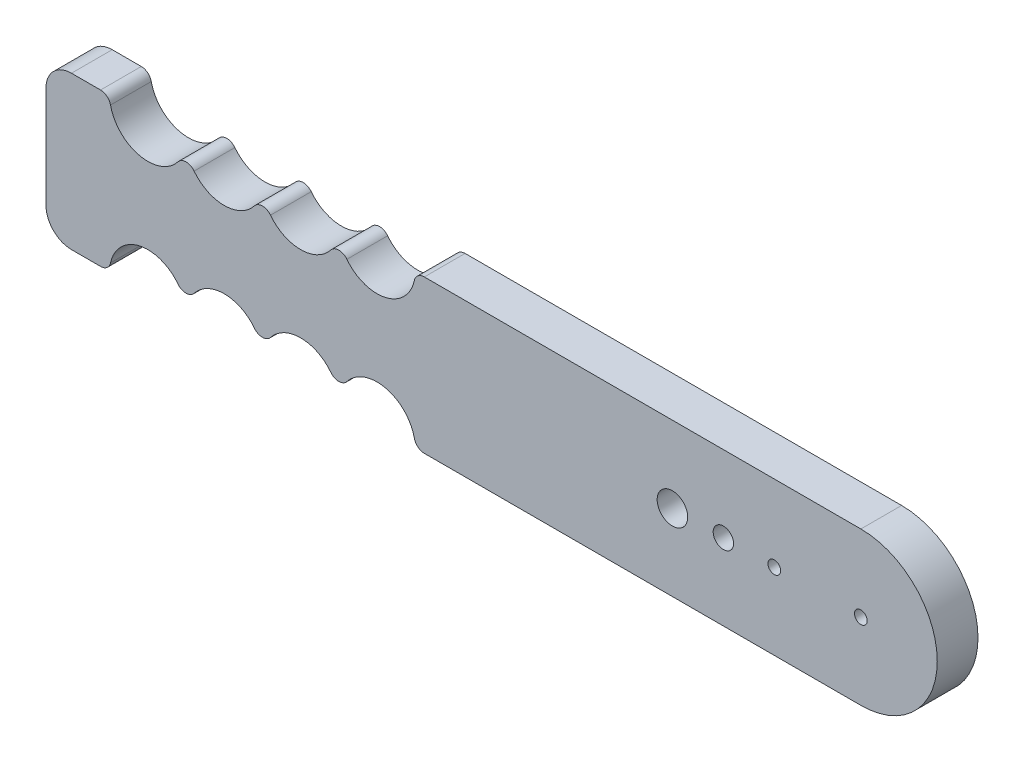
ISO-10303-21;
HEADER;
FILE_DESCRIPTION(('STEP AP214'),'2;1');
FILE_NAME('part.step','',(''),(''),'','','');
FILE_SCHEMA(('AUTOMOTIVE_DESIGN { 1 0 10303 214 1 1 1 1 }'));
ENDSEC;
DATA;
#1=APPLICATION_CONTEXT('core data for automotive mechanical design processes');
#2=APPLICATION_PROTOCOL_DEFINITION('international standard','automotive_design',2000,#1);
#3=PRODUCT_CONTEXT('',#1,'mechanical');
#4=PRODUCT('Part','Part','',(#3));
#5=PRODUCT_RELATED_PRODUCT_CATEGORY('part','',(#4));
#6=PRODUCT_DEFINITION_FORMATION('','',#4);
#7=PRODUCT_DEFINITION_CONTEXT('part definition',#1,'design');
#8=PRODUCT_DEFINITION('design','',#6,#7);
#9=PRODUCT_DEFINITION_SHAPE('','',#8);
#10=(LENGTH_UNIT() NAMED_UNIT(*) SI_UNIT(.MILLI.,.METRE.));
#11=(NAMED_UNIT(*) PLANE_ANGLE_UNIT() SI_UNIT($,.RADIAN.));
#12=(NAMED_UNIT(*) SI_UNIT($,.STERADIAN.) SOLID_ANGLE_UNIT());
#13=UNCERTAINTY_MEASURE_WITH_UNIT(LENGTH_MEASURE(1.E-05),#10,'distance_accuracy_value','');
#14=(GEOMETRIC_REPRESENTATION_CONTEXT(3) GLOBAL_UNCERTAINTY_ASSIGNED_CONTEXT((#13)) GLOBAL_UNIT_ASSIGNED_CONTEXT((#10,
#11,#12)) REPRESENTATION_CONTEXT('',''));
#15=CARTESIAN_POINT('',(0.,0.,0.));
#16=DIRECTION('',(0.,0.,1.));
#17=DIRECTION('',(1.,0.,0.));
#18=AXIS2_PLACEMENT_3D('',#15,#16,#17);
#19=CARTESIAN_POINT('',(0.,0.,8.));
#20=DIRECTION('',(0.,0.,1.));
#21=DIRECTION('',(1.,0.,0.));
#22=AXIS2_PLACEMENT_3D('',#19,#20,#21);
#23=PLANE('',#22);
#24=CARTESIAN_POINT('',(-37.,0.,8.));
#25=DIRECTION('',(0.,0.,1.));
#26=DIRECTION('',(1.,0.,0.));
#27=AXIS2_PLACEMENT_3D('',#24,#25,#26);
#28=CIRCLE('',#27,3.);
#29=CARTESIAN_POINT('',(-34.,0.,8.));
#30=VERTEX_POINT('',#29);
#31=EDGE_CURVE('E786',#30,#30,#28,.T.);
#32=ORIENTED_EDGE('',*,*,#31,.F.);
#33=EDGE_LOOP('',(#32));
#34=FACE_BOUND('',#33,.T.);
#35=CARTESIAN_POINT('',(0.,0.,8.));
#36=DIRECTION('',(0.,0.,1.));
#37=DIRECTION('',(1.,0.,0.));
#38=AXIS2_PLACEMENT_3D('',#35,#36,#37);
#39=CIRCLE('',#38,1.25);
#40=CARTESIAN_POINT('',(1.25,0.,8.));
#41=VERTEX_POINT('',#40);
#42=EDGE_CURVE('E383',#41,#41,#39,.T.);
#43=ORIENTED_EDGE('',*,*,#42,.F.);
#44=EDGE_LOOP('',(#43));
#45=FACE_BOUND('',#44,.T.);
#46=CARTESIAN_POINT('',(-95.,-15.,8.));
#47=DIRECTION('',(0.,0.,-1.));
#48=DIRECTION('',(-1.,0.,0.));
#49=AXIS2_PLACEMENT_3D('',#46,#47,#48);
#50=CIRCLE('',#49,7.50000000000001);
#51=CARTESIAN_POINT('',(-100.921052631579,-10.3966169251221,8.));
#52=VERTEX_POINT('',#51);
#53=CARTESIAN_POINT('',(-87.6680885706552,-13.421052631579,8.));
#54=VERTEX_POINT('',#53);
#55=EDGE_CURVE('E434',#52,#54,#50,.T.);
#56=ORIENTED_EDGE('',*,*,#55,.T.);
#57=CARTESIAN_POINT('',(-85.7129121894966,-13.,8.));
#58=DIRECTION('',(0.,0.,1.));
#59=DIRECTION('',(1.,0.,0.));
#60=AXIS2_PLACEMENT_3D('',#57,#58,#59);
#61=CIRCLE('',#60,2.);
#62=CARTESIAN_POINT('',(-85.7129121894966,-15.,8.));
#63=VERTEX_POINT('',#62);
#64=EDGE_CURVE('E304',#54,#63,#61,.T.);
#65=ORIENTED_EDGE('',*,*,#64,.T.);
#66=DIRECTION('',(1.,0.,0.));
#67=VECTOR('',#66,1.);
#68=CARTESIAN_POINT('',(0.,-15.,8.));
#69=LINE('',#68,#67);
#70=CARTESIAN_POINT('',(0.,-15.,8.));
#71=VERTEX_POINT('',#70);
#72=EDGE_CURVE('E225',#63,#71,#69,.T.);
#73=ORIENTED_EDGE('',*,*,#72,.T.);
#74=CARTESIAN_POINT('',(0.,0.,8.));
#75=DIRECTION('',(0.,0.,1.));
#76=DIRECTION('',(1.,0.,0.));
#77=AXIS2_PLACEMENT_3D('',#74,#75,#76);
#78=CIRCLE('',#77,15.);
#79=CARTESIAN_POINT('',(0.,15.,8.));
#80=VERTEX_POINT('',#79);
#81=EDGE_CURVE('E219',#71,#80,#78,.T.);
#82=ORIENTED_EDGE('',*,*,#81,.T.);
#83=DIRECTION('',(-1.,0.,0.));
#84=VECTOR('',#83,1.);
#85=CARTESIAN_POINT('',(0.,15.,8.));
#86=LINE('',#85,#84);
#87=CARTESIAN_POINT('',(-85.7129121894966,15.,8.));
#88=VERTEX_POINT('',#87);
#89=EDGE_CURVE('E208',#80,#88,#86,.T.);
#90=ORIENTED_EDGE('',*,*,#89,.T.);
#91=CARTESIAN_POINT('',(-85.7129121894966,13.,8.));
#92=DIRECTION('',(0.,0.,1.));
#93=DIRECTION('',(1.,0.,0.));
#94=AXIS2_PLACEMENT_3D('',#91,#92,#93);
#95=CIRCLE('',#94,2.);
#96=CARTESIAN_POINT('',(-87.6680885706552,13.4210526315789,8.));
#97=VERTEX_POINT('',#96);
#98=EDGE_CURVE('E294',#88,#97,#95,.T.);
#99=ORIENTED_EDGE('',*,*,#98,.T.);
#100=CARTESIAN_POINT('',(-95.,15.,8.));
#101=DIRECTION('',(0.,0.,-1.));
#102=DIRECTION('',(1.,0.,0.));
#103=AXIS2_PLACEMENT_3D('',#100,#101,#102);
#104=CIRCLE('',#103,7.50000000000001);
#105=CARTESIAN_POINT('',(-100.921052631579,10.3966169251221,8.));
#106=VERTEX_POINT('',#105);
#107=EDGE_CURVE('E218',#97,#106,#104,.T.);
#108=ORIENTED_EDGE('',*,*,#107,.T.);
#109=CARTESIAN_POINT('',(-102.5,9.16904810515469,8.));
#110=DIRECTION('',(0.,0.,1.));
#111=DIRECTION('',(1.,0.,0.));
#112=AXIS2_PLACEMENT_3D('',#109,#110,#111);
#113=CIRCLE('',#112,2.);
#114=CARTESIAN_POINT('',(-104.078947368421,10.3966169251221,8.));
#115=VERTEX_POINT('',#114);
#116=EDGE_CURVE('E292',#106,#115,#113,.T.);
#117=ORIENTED_EDGE('',*,*,#116,.T.);
#118=CARTESIAN_POINT('',(-110.,15.,8.));
#119=DIRECTION('',(0.,0.,-1.));
#120=DIRECTION('',(1.,0.,0.));
#121=AXIS2_PLACEMENT_3D('',#118,#119,#120);
#122=CIRCLE('',#121,7.49999999999999);
#123=CARTESIAN_POINT('',(-115.921052631579,10.3966169251221,8.));
#124=VERTEX_POINT('',#123);
#125=EDGE_CURVE('E409',#115,#124,#122,.T.);
#126=ORIENTED_EDGE('',*,*,#125,.T.);
#127=CARTESIAN_POINT('',(-117.5,9.16904810515469,8.));
#128=DIRECTION('',(0.,0.,1.));
#129=DIRECTION('',(1.,0.,0.));
#130=AXIS2_PLACEMENT_3D('',#127,#128,#129);
#131=CIRCLE('',#130,2.);
#132=CARTESIAN_POINT('',(-119.078947368421,10.3966169251221,8.));
#133=VERTEX_POINT('',#132);
#134=EDGE_CURVE('E290',#124,#133,#131,.T.);
#135=ORIENTED_EDGE('',*,*,#134,.T.);
#136=CARTESIAN_POINT('',(-125.,15.,8.));
#137=DIRECTION('',(0.,0.,-1.));
#138=DIRECTION('',(1.,0.,0.));
#139=AXIS2_PLACEMENT_3D('',#136,#137,#138);
#140=CIRCLE('',#139,7.50000000000001);
#141=CARTESIAN_POINT('',(-130.921052631579,10.3966169251221,8.));
#142=VERTEX_POINT('',#141);
#143=EDGE_CURVE('E408',#133,#142,#140,.T.);
#144=ORIENTED_EDGE('',*,*,#143,.T.);
#145=CARTESIAN_POINT('',(-132.5,9.16904810515468,8.));
#146=DIRECTION('',(0.,0.,1.));
#147=DIRECTION('',(1.,0.,0.));
#148=AXIS2_PLACEMENT_3D('',#145,#146,#147);
#149=CIRCLE('',#148,2.);
#150=CARTESIAN_POINT('',(-134.078947368421,10.3966169251221,8.));
#151=VERTEX_POINT('',#150);
#152=EDGE_CURVE('E288',#142,#151,#149,.T.);
#153=ORIENTED_EDGE('',*,*,#152,.T.);
#154=CARTESIAN_POINT('',(-140.,15.,8.));
#155=DIRECTION('',(0.,0.,-1.));
#156=DIRECTION('',(1.,0.,0.));
#157=AXIS2_PLACEMENT_3D('',#154,#155,#156);
#158=CIRCLE('',#157,7.50000000000001);
#159=CARTESIAN_POINT('',(-147.331911429345,13.4210526315789,8.));
#160=VERTEX_POINT('',#159);
#161=EDGE_CURVE('E344',#151,#160,#158,.T.);
#162=ORIENTED_EDGE('',*,*,#161,.T.);
#163=CARTESIAN_POINT('',(-149.287087810503,13.,8.));
#164=DIRECTION('',(0.,0.,1.));
#165=DIRECTION('',(1.,0.,0.));
#166=AXIS2_PLACEMENT_3D('',#163,#164,#165);
#167=CIRCLE('',#166,2.);
#168=CARTESIAN_POINT('',(-149.287087810503,15.,8.));
#169=VERTEX_POINT('',#168);
#170=EDGE_CURVE('E48',#160,#169,#167,.T.);
#171=ORIENTED_EDGE('',*,*,#170,.T.);
#172=DIRECTION('',(-1.,0.,0.));
#173=VECTOR('',#172,1.);
#174=CARTESIAN_POINT('',(-147.5,15.,8.));
#175=LINE('',#174,#173);
#176=CARTESIAN_POINT('',(-155.,15.,8.));
#177=VERTEX_POINT('',#176);
#178=EDGE_CURVE('E414',#169,#177,#175,.T.);
#179=ORIENTED_EDGE('',*,*,#178,.T.);
#180=CARTESIAN_POINT('',(-155.,9.99999999999998,8.));
#181=DIRECTION('',(0.,0.,1.));
#182=DIRECTION('',(1.,0.,0.));
#183=AXIS2_PLACEMENT_3D('',#180,#181,#182);
#184=CIRCLE('',#183,5.);
#185=CARTESIAN_POINT('',(-160.,9.99999999999998,8.));
#186=VERTEX_POINT('',#185);
#187=EDGE_CURVE('E252',#177,#186,#184,.T.);
#188=ORIENTED_EDGE('',*,*,#187,.T.);
#189=DIRECTION('',(0.,-1.,0.));
#190=VECTOR('',#189,1.);
#191=CARTESIAN_POINT('',(-160.,15.,8.));
#192=LINE('',#191,#190);
#193=CARTESIAN_POINT('',(-160.,-10.,8.));
#194=VERTEX_POINT('',#193);
#195=EDGE_CURVE('E420',#186,#194,#192,.T.);
#196=ORIENTED_EDGE('',*,*,#195,.T.);
#197=CARTESIAN_POINT('',(-155.,-10.,8.));
#198=DIRECTION('',(0.,0.,1.));
#199=DIRECTION('',(1.,0.,0.));
#200=AXIS2_PLACEMENT_3D('',#197,#198,#199);
#201=CIRCLE('',#200,5.);
#202=CARTESIAN_POINT('',(-155.,-15.,8.));
#203=VERTEX_POINT('',#202);
#204=EDGE_CURVE('E254',#194,#203,#201,.T.);
#205=ORIENTED_EDGE('',*,*,#204,.T.);
#206=DIRECTION('',(1.,0.,0.));
#207=VECTOR('',#206,1.);
#208=CARTESIAN_POINT('',(-147.5,-15.,8.));
#209=LINE('',#208,#207);
#210=CARTESIAN_POINT('',(-149.287087810503,-15.,8.));
#211=VERTEX_POINT('',#210);
#212=EDGE_CURVE('E423',#203,#211,#209,.T.);
#213=ORIENTED_EDGE('',*,*,#212,.T.);
#214=CARTESIAN_POINT('',(-149.287087810503,-13.,8.));
#215=DIRECTION('',(0.,0.,1.));
#216=DIRECTION('',(1.,0.,0.));
#217=AXIS2_PLACEMENT_3D('',#214,#215,#216);
#218=CIRCLE('',#217,2.);
#219=CARTESIAN_POINT('',(-147.331911429345,-13.421052631579,8.));
#220=VERTEX_POINT('',#219);
#221=EDGE_CURVE('E296',#211,#220,#218,.T.);
#222=ORIENTED_EDGE('',*,*,#221,.T.);
#223=CARTESIAN_POINT('',(-140.,-15.,8.));
#224=DIRECTION('',(0.,0.,-1.));
#225=DIRECTION('',(-1.,0.,0.));
#226=AXIS2_PLACEMENT_3D('',#223,#224,#225);
#227=CIRCLE('',#226,7.50000000000001);
#228=CARTESIAN_POINT('',(-134.078947368421,-10.3966169251221,8.));
#229=VERTEX_POINT('',#228);
#230=EDGE_CURVE('E426',#220,#229,#227,.T.);
#231=ORIENTED_EDGE('',*,*,#230,.T.);
#232=CARTESIAN_POINT('',(-132.5,-9.1690481051547,8.));
#233=DIRECTION('',(0.,0.,1.));
#234=DIRECTION('',(1.,0.,0.));
#235=AXIS2_PLACEMENT_3D('',#232,#233,#234);
#236=CIRCLE('',#235,2.);
#237=CARTESIAN_POINT('',(-130.921052631579,-10.3966169251221,8.));
#238=VERTEX_POINT('',#237);
#239=EDGE_CURVE('E298',#229,#238,#236,.T.);
#240=ORIENTED_EDGE('',*,*,#239,.T.);
#241=CARTESIAN_POINT('',(-125.,-15.,8.));
#242=DIRECTION('',(0.,0.,-1.));
#243=DIRECTION('',(-1.,0.,0.));
#244=AXIS2_PLACEMENT_3D('',#241,#242,#243);
#245=CIRCLE('',#244,7.50000000000001);
#246=CARTESIAN_POINT('',(-119.078947368421,-10.3966169251221,8.));
#247=VERTEX_POINT('',#246);
#248=EDGE_CURVE('E429',#238,#247,#245,.T.);
#249=ORIENTED_EDGE('',*,*,#248,.T.);
#250=CARTESIAN_POINT('',(-117.5,-9.16904810515471,8.));
#251=DIRECTION('',(0.,0.,1.));
#252=DIRECTION('',(1.,0.,0.));
#253=AXIS2_PLACEMENT_3D('',#250,#251,#252);
#254=CIRCLE('',#253,2.);
#255=CARTESIAN_POINT('',(-115.921052631579,-10.3966169251221,8.));
#256=VERTEX_POINT('',#255);
#257=EDGE_CURVE('E300',#247,#256,#254,.T.);
#258=ORIENTED_EDGE('',*,*,#257,.T.);
#259=CARTESIAN_POINT('',(-110.,-15.,8.));
#260=DIRECTION('',(0.,0.,-1.));
#261=DIRECTION('',(-1.,0.,0.));
#262=AXIS2_PLACEMENT_3D('',#259,#260,#261);
#263=CIRCLE('',#262,7.49999999999999);
#264=CARTESIAN_POINT('',(-104.078947368421,-10.3966169251221,8.));
#265=VERTEX_POINT('',#264);
#266=EDGE_CURVE('E432',#256,#265,#263,.T.);
#267=ORIENTED_EDGE('',*,*,#266,.T.);
#268=CARTESIAN_POINT('',(-102.5,-9.16904810515471,8.));
#269=DIRECTION('',(0.,0.,1.));
#270=DIRECTION('',(1.,0.,0.));
#271=AXIS2_PLACEMENT_3D('',#268,#269,#270);
#272=CIRCLE('',#271,2.);
#273=EDGE_CURVE('E302',#265,#52,#272,.T.);
#274=ORIENTED_EDGE('',*,*,#273,.T.);
#275=EDGE_LOOP('',(#56,#65,#73,#82,#90,#99,#108,#117,#126,#135,#144,#153,#162,#171,#179,#188,
#196,#205,#213,#222,#231,#240,#249,#258,#267,#274));
#276=FACE_BOUND('',#275,.T.);
#277=CARTESIAN_POINT('',(-17.,0.,8.));
#278=DIRECTION('',(0.,0.,1.));
#279=DIRECTION('',(1.,0.,0.));
#280=AXIS2_PLACEMENT_3D('',#277,#278,#279);
#281=CIRCLE('',#280,1.25);
#282=CARTESIAN_POINT('',(-15.75,0.,8.));
#283=VERTEX_POINT('',#282);
#284=EDGE_CURVE('E773',#283,#283,#281,.T.);
#285=ORIENTED_EDGE('',*,*,#284,.F.);
#286=EDGE_LOOP('',(#285));
#287=FACE_BOUND('',#286,.T.);
#288=CARTESIAN_POINT('',(-27.,0.,8.));
#289=DIRECTION('',(0.,0.,1.));
#290=DIRECTION('',(1.,0.,0.));
#291=AXIS2_PLACEMENT_3D('',#288,#289,#290);
#292=CIRCLE('',#291,2.);
#293=CARTESIAN_POINT('',(-25.,0.,8.));
#294=VERTEX_POINT('',#293);
#295=EDGE_CURVE('E791',#294,#294,#292,.T.);
#296=ORIENTED_EDGE('',*,*,#295,.F.);
#297=EDGE_LOOP('',(#296));
#298=FACE_BOUND('',#297,.T.);
#299=ADVANCED_FACE('F33',(#34,#45,#276,#287,#298),#23,.T.);
#300=CARTESIAN_POINT('',(0.,0.,0.));
#301=DIRECTION('',(0.,0.,1.));
#302=DIRECTION('',(1.,0.,0.));
#303=AXIS2_PLACEMENT_3D('',#300,#301,#302);
#304=PLANE('',#303);
#305=DIRECTION('',(1.,0.,0.));
#306=VECTOR('',#305,1.);
#307=CARTESIAN_POINT('',(0.,-15.,0.));
#308=LINE('',#307,#306);
#309=CARTESIAN_POINT('',(-85.7129121894966,-15.,0.));
#310=VERTEX_POINT('',#309);
#311=CARTESIAN_POINT('',(0.,-15.,0.));
#312=VERTEX_POINT('',#311);
#313=EDGE_CURVE('E229',#310,#312,#308,.T.);
#314=ORIENTED_EDGE('',*,*,#313,.F.);
#315=CARTESIAN_POINT('',(-85.7129121894966,-13.,0.));
#316=DIRECTION('',(0.,0.,1.));
#317=DIRECTION('',(1.,0.,0.));
#318=AXIS2_PLACEMENT_3D('',#315,#316,#317);
#319=CIRCLE('',#318,2.);
#320=CARTESIAN_POINT('',(-87.6680885706552,-13.421052631579,0.));
#321=VERTEX_POINT('',#320);
#322=EDGE_CURVE('E280',#310,#321,#319,.F.);
#323=ORIENTED_EDGE('',*,*,#322,.T.);
#324=CARTESIAN_POINT('',(-95.,-15.,0.));
#325=DIRECTION('',(0.,0.,-1.));
#326=DIRECTION('',(-1.,0.,0.));
#327=AXIS2_PLACEMENT_3D('',#324,#325,#326);
#328=CIRCLE('',#327,7.50000000000001);
#329=CARTESIAN_POINT('',(-100.921052631579,-10.3966169251221,0.));
#330=VERTEX_POINT('',#329);
#331=EDGE_CURVE('E377',#330,#321,#328,.T.);
#332=ORIENTED_EDGE('',*,*,#331,.F.);
#333=CARTESIAN_POINT('',(-102.5,-9.16904810515471,0.));
#334=DIRECTION('',(0.,0.,1.));
#335=DIRECTION('',(1.,0.,0.));
#336=AXIS2_PLACEMENT_3D('',#333,#334,#335);
#337=CIRCLE('',#336,2.);
#338=CARTESIAN_POINT('',(-104.078947368421,-10.3966169251221,0.));
#339=VERTEX_POINT('',#338);
#340=EDGE_CURVE('E278',#330,#339,#337,.F.);
#341=ORIENTED_EDGE('',*,*,#340,.T.);
#342=CARTESIAN_POINT('',(-110.,-15.,0.));
#343=DIRECTION('',(0.,0.,-1.));
#344=DIRECTION('',(-1.,0.,0.));
#345=AXIS2_PLACEMENT_3D('',#342,#343,#344);
#346=CIRCLE('',#345,7.49999999999999);
#347=CARTESIAN_POINT('',(-115.921052631579,-10.3966169251221,0.));
#348=VERTEX_POINT('',#347);
#349=EDGE_CURVE('E374',#348,#339,#346,.T.);
#350=ORIENTED_EDGE('',*,*,#349,.F.);
#351=CARTESIAN_POINT('',(-117.5,-9.16904810515471,0.));
#352=DIRECTION('',(0.,0.,1.));
#353=DIRECTION('',(1.,0.,0.));
#354=AXIS2_PLACEMENT_3D('',#351,#352,#353);
#355=CIRCLE('',#354,2.);
#356=CARTESIAN_POINT('',(-119.078947368421,-10.3966169251221,0.));
#357=VERTEX_POINT('',#356);
#358=EDGE_CURVE('E276',#348,#357,#355,.F.);
#359=ORIENTED_EDGE('',*,*,#358,.T.);
#360=CARTESIAN_POINT('',(-125.,-15.,0.));
#361=DIRECTION('',(0.,0.,-1.));
#362=DIRECTION('',(-1.,0.,0.));
#363=AXIS2_PLACEMENT_3D('',#360,#361,#362);
#364=CIRCLE('',#363,7.50000000000001);
#365=CARTESIAN_POINT('',(-130.921052631579,-10.3966169251221,0.));
#366=VERTEX_POINT('',#365);
#367=EDGE_CURVE('E371',#366,#357,#364,.T.);
#368=ORIENTED_EDGE('',*,*,#367,.F.);
#369=CARTESIAN_POINT('',(-132.5,-9.1690481051547,0.));
#370=DIRECTION('',(0.,0.,1.));
#371=DIRECTION('',(1.,0.,0.));
#372=AXIS2_PLACEMENT_3D('',#369,#370,#371);
#373=CIRCLE('',#372,2.);
#374=CARTESIAN_POINT('',(-134.078947368421,-10.3966169251221,0.));
#375=VERTEX_POINT('',#374);
#376=EDGE_CURVE('E274',#366,#375,#373,.F.);
#377=ORIENTED_EDGE('',*,*,#376,.T.);
#378=CARTESIAN_POINT('',(-140.,-15.,0.));
#379=DIRECTION('',(0.,0.,-1.));
#380=DIRECTION('',(-1.,0.,0.));
#381=AXIS2_PLACEMENT_3D('',#378,#379,#380);
#382=CIRCLE('',#381,7.50000000000001);
#383=CARTESIAN_POINT('',(-147.331911429345,-13.421052631579,0.));
#384=VERTEX_POINT('',#383);
#385=EDGE_CURVE('E368',#384,#375,#382,.T.);
#386=ORIENTED_EDGE('',*,*,#385,.F.);
#387=CARTESIAN_POINT('',(-149.287087810503,-13.,0.));
#388=DIRECTION('',(0.,0.,1.));
#389=DIRECTION('',(1.,0.,0.));
#390=AXIS2_PLACEMENT_3D('',#387,#388,#389);
#391=CIRCLE('',#390,2.);
#392=CARTESIAN_POINT('',(-149.287087810503,-15.,0.));
#393=VERTEX_POINT('',#392);
#394=EDGE_CURVE('E272',#384,#393,#391,.F.);
#395=ORIENTED_EDGE('',*,*,#394,.T.);
#396=DIRECTION('',(1.,0.,0.));
#397=VECTOR('',#396,1.);
#398=CARTESIAN_POINT('',(-147.5,-15.,0.));
#399=LINE('',#398,#397);
#400=CARTESIAN_POINT('',(-155.,-15.,0.));
#401=VERTEX_POINT('',#400);
#402=EDGE_CURVE('E365',#401,#393,#399,.T.);
#403=ORIENTED_EDGE('',*,*,#402,.F.);
#404=CARTESIAN_POINT('',(-155.,-10.,0.));
#405=DIRECTION('',(0.,0.,1.));
#406=DIRECTION('',(1.,0.,0.));
#407=AXIS2_PLACEMENT_3D('',#404,#405,#406);
#408=CIRCLE('',#407,5.);
#409=CARTESIAN_POINT('',(-160.,-10.,0.));
#410=VERTEX_POINT('',#409);
#411=EDGE_CURVE('E245',#401,#410,#408,.F.);
#412=ORIENTED_EDGE('',*,*,#411,.T.);
#413=DIRECTION('',(0.,-1.,0.));
#414=VECTOR('',#413,1.);
#415=CARTESIAN_POINT('',(-160.,15.,0.));
#416=LINE('',#415,#414);
#417=CARTESIAN_POINT('',(-160.,9.99999999999998,0.));
#418=VERTEX_POINT('',#417);
#419=EDGE_CURVE('E357',#418,#410,#416,.T.);
#420=ORIENTED_EDGE('',*,*,#419,.F.);
#421=CARTESIAN_POINT('',(-155.,9.99999999999998,0.));
#422=DIRECTION('',(0.,0.,1.));
#423=DIRECTION('',(1.,0.,0.));
#424=AXIS2_PLACEMENT_3D('',#421,#422,#423);
#425=CIRCLE('',#424,5.);
#426=CARTESIAN_POINT('',(-155.,15.,0.));
#427=VERTEX_POINT('',#426);
#428=EDGE_CURVE('E238',#418,#427,#425,.F.);
#429=ORIENTED_EDGE('',*,*,#428,.T.);
#430=DIRECTION('',(-1.,0.,0.));
#431=VECTOR('',#430,1.);
#432=CARTESIAN_POINT('',(-147.5,15.,0.));
#433=LINE('',#432,#431);
#434=CARTESIAN_POINT('',(-149.287087810503,15.,0.));
#435=VERTEX_POINT('',#434);
#436=EDGE_CURVE('E354',#435,#427,#433,.T.);
#437=ORIENTED_EDGE('',*,*,#436,.F.);
#438=CARTESIAN_POINT('',(-149.287087810503,13.,0.));
#439=DIRECTION('',(0.,0.,1.));
#440=DIRECTION('',(1.,0.,0.));
#441=AXIS2_PLACEMENT_3D('',#438,#439,#440);
#442=CIRCLE('',#441,2.);
#443=CARTESIAN_POINT('',(-147.331911429345,13.4210526315789,0.));
#444=VERTEX_POINT('',#443);
#445=EDGE_CURVE('E262',#435,#444,#442,.F.);
#446=ORIENTED_EDGE('',*,*,#445,.T.);
#447=CARTESIAN_POINT('',(-140.,15.,0.));
#448=DIRECTION('',(0.,0.,-1.));
#449=DIRECTION('',(1.,0.,0.));
#450=AXIS2_PLACEMENT_3D('',#447,#448,#449);
#451=CIRCLE('',#450,7.50000000000001);
#452=CARTESIAN_POINT('',(-134.078947368421,10.3966169251221,0.));
#453=VERTEX_POINT('',#452);
#454=EDGE_CURVE('E343',#453,#444,#451,.T.);
#455=ORIENTED_EDGE('',*,*,#454,.F.);
#456=CARTESIAN_POINT('',(-132.5,9.16904810515468,0.));
#457=DIRECTION('',(0.,0.,1.));
#458=DIRECTION('',(1.,0.,0.));
#459=AXIS2_PLACEMENT_3D('',#456,#457,#458);
#460=CIRCLE('',#459,2.);
#461=CARTESIAN_POINT('',(-130.921052631579,10.3966169251221,0.));
#462=VERTEX_POINT('',#461);
#463=EDGE_CURVE('E264',#453,#462,#460,.F.);
#464=ORIENTED_EDGE('',*,*,#463,.T.);
#465=CARTESIAN_POINT('',(-125.,15.,0.));
#466=DIRECTION('',(0.,0.,-1.));
#467=DIRECTION('',(1.,0.,0.));
#468=AXIS2_PLACEMENT_3D('',#465,#466,#467);
#469=CIRCLE('',#468,7.50000000000001);
#470=CARTESIAN_POINT('',(-119.078947368421,10.3966169251221,0.));
#471=VERTEX_POINT('',#470);
#472=EDGE_CURVE('E355',#471,#462,#469,.T.);
#473=ORIENTED_EDGE('',*,*,#472,.F.);
#474=CARTESIAN_POINT('',(-117.5,9.16904810515469,0.));
#475=DIRECTION('',(0.,0.,1.));
#476=DIRECTION('',(1.,0.,0.));
#477=AXIS2_PLACEMENT_3D('',#474,#475,#476);
#478=CIRCLE('',#477,2.);
#479=CARTESIAN_POINT('',(-115.921052631579,10.3966169251221,0.));
#480=VERTEX_POINT('',#479);
#481=EDGE_CURVE('E266',#471,#480,#478,.F.);
#482=ORIENTED_EDGE('',*,*,#481,.T.);
#483=CARTESIAN_POINT('',(-110.,15.,0.));
#484=DIRECTION('',(0.,0.,-1.));
#485=DIRECTION('',(1.,0.,0.));
#486=AXIS2_PLACEMENT_3D('',#483,#484,#485);
#487=CIRCLE('',#486,7.49999999999999);
#488=CARTESIAN_POINT('',(-104.078947368421,10.3966169251221,0.));
#489=VERTEX_POINT('',#488);
#490=EDGE_CURVE('E359',#489,#480,#487,.T.);
#491=ORIENTED_EDGE('',*,*,#490,.F.);
#492=CARTESIAN_POINT('',(-102.5,9.16904810515469,0.));
#493=DIRECTION('',(0.,0.,1.));
#494=DIRECTION('',(1.,0.,0.));
#495=AXIS2_PLACEMENT_3D('',#492,#493,#494);
#496=CIRCLE('',#495,2.);
#497=CARTESIAN_POINT('',(-100.921052631579,10.3966169251221,0.));
#498=VERTEX_POINT('',#497);
#499=EDGE_CURVE('E268',#489,#498,#496,.F.);
#500=ORIENTED_EDGE('',*,*,#499,.T.);
#501=CARTESIAN_POINT('',(-95.,15.,0.));
#502=DIRECTION('',(0.,0.,-1.));
#503=DIRECTION('',(1.,0.,0.));
#504=AXIS2_PLACEMENT_3D('',#501,#502,#503);
#505=CIRCLE('',#504,7.50000000000001);
#506=CARTESIAN_POINT('',(-87.6680885706552,13.4210526315789,0.));
#507=VERTEX_POINT('',#506);
#508=EDGE_CURVE('E385',#507,#498,#505,.T.);
#509=ORIENTED_EDGE('',*,*,#508,.F.);
#510=CARTESIAN_POINT('',(-85.7129121894966,13.,0.));
#511=DIRECTION('',(0.,0.,1.));
#512=DIRECTION('',(1.,0.,0.));
#513=AXIS2_PLACEMENT_3D('',#510,#511,#512);
#514=CIRCLE('',#513,2.);
#515=CARTESIAN_POINT('',(-85.7129121894966,15.,0.));
#516=VERTEX_POINT('',#515);
#517=EDGE_CURVE('E270',#507,#516,#514,.F.);
#518=ORIENTED_EDGE('',*,*,#517,.T.);
#519=DIRECTION('',(-1.,0.,0.));
#520=VECTOR('',#519,1.);
#521=CARTESIAN_POINT('',(0.,15.,0.));
#522=LINE('',#521,#520);
#523=CARTESIAN_POINT('',(0.,15.,0.));
#524=VERTEX_POINT('',#523);
#525=EDGE_CURVE('E382',#524,#516,#522,.T.);
#526=ORIENTED_EDGE('',*,*,#525,.F.);
#527=CARTESIAN_POINT('',(0.,0.,0.));
#528=DIRECTION('',(0.,0.,1.));
#529=DIRECTION('',(1.,0.,0.));
#530=AXIS2_PLACEMENT_3D('',#527,#528,#529);
#531=CIRCLE('',#530,15.);
#532=EDGE_CURVE('E233',#312,#524,#531,.T.);
#533=ORIENTED_EDGE('',*,*,#532,.F.);
#534=EDGE_LOOP('',(#314,#323,#332,#341,#350,#359,#368,#377,#386,#395,#403,#412,#420,#429,#437,
#446,#455,#464,#473,#482,#491,#500,#509,#518,#526,#533));
#535=FACE_BOUND('',#534,.T.);
#536=CARTESIAN_POINT('',(0.,0.,0.));
#537=DIRECTION('',(0.,0.,1.));
#538=DIRECTION('',(1.,0.,0.));
#539=AXIS2_PLACEMENT_3D('',#536,#537,#538);
#540=CIRCLE('',#539,1.25);
#541=CARTESIAN_POINT('',(1.25,0.,0.));
#542=VERTEX_POINT('',#541);
#543=EDGE_CURVE('E388',#542,#542,#540,.T.);
#544=ORIENTED_EDGE('',*,*,#543,.T.);
#545=EDGE_LOOP('',(#544));
#546=FACE_BOUND('',#545,.T.);
#547=CARTESIAN_POINT('',(-17.,0.,0.));
#548=DIRECTION('',(0.,0.,1.));
#549=DIRECTION('',(1.,0.,0.));
#550=AXIS2_PLACEMENT_3D('',#547,#548,#549);
#551=CIRCLE('',#550,1.25);
#552=CARTESIAN_POINT('',(-15.75,0.,0.));
#553=VERTEX_POINT('',#552);
#554=EDGE_CURVE('E776',#553,#553,#551,.T.);
#555=ORIENTED_EDGE('',*,*,#554,.T.);
#556=EDGE_LOOP('',(#555));
#557=FACE_BOUND('',#556,.T.);
#558=CARTESIAN_POINT('',(-37.,0.,0.));
#559=DIRECTION('',(0.,0.,1.));
#560=DIRECTION('',(1.,0.,0.));
#561=AXIS2_PLACEMENT_3D('',#558,#559,#560);
#562=CIRCLE('',#561,3.);
#563=CARTESIAN_POINT('',(-34.,0.,0.));
#564=VERTEX_POINT('',#563);
#565=EDGE_CURVE('E788',#564,#564,#562,.T.);
#566=ORIENTED_EDGE('',*,*,#565,.T.);
#567=EDGE_LOOP('',(#566));
#568=FACE_BOUND('',#567,.T.);
#569=CARTESIAN_POINT('',(-27.,0.,0.));
#570=DIRECTION('',(0.,0.,1.));
#571=DIRECTION('',(1.,0.,0.));
#572=AXIS2_PLACEMENT_3D('',#569,#570,#571);
#573=CIRCLE('',#572,2.);
#574=CARTESIAN_POINT('',(-25.,0.,0.));
#575=VERTEX_POINT('',#574);
#576=EDGE_CURVE('E794',#575,#575,#573,.T.);
#577=ORIENTED_EDGE('',*,*,#576,.T.);
#578=EDGE_LOOP('',(#577));
#579=FACE_BOUND('',#578,.T.);
#580=ADVANCED_FACE('F349',(#535,#546,#557,#568,#579),#304,.F.);
#581=CARTESIAN_POINT('',(0.,0.,8.));
#582=DIRECTION('',(0.,0.,-1.));
#583=DIRECTION('',(-1.,0.,0.));
#584=AXIS2_PLACEMENT_3D('',#581,#582,#583);
#585=CYLINDRICAL_SURFACE('',#584,15.);
#586=ORIENTED_EDGE('',*,*,#532,.T.);
#587=DIRECTION('',(0.,0.,-1.));
#588=VECTOR('',#587,1.);
#589=CARTESIAN_POINT('',(0.,15.,8.));
#590=LINE('',#589,#588);
#591=EDGE_CURVE('E213',#80,#524,#590,.T.);
#592=ORIENTED_EDGE('',*,*,#591,.F.);
#593=ORIENTED_EDGE('',*,*,#81,.F.);
#594=DIRECTION('',(0.,0.,-1.));
#595=VECTOR('',#594,1.);
#596=CARTESIAN_POINT('',(0.,-15.,8.));
#597=LINE('',#596,#595);
#598=EDGE_CURVE('E235',#71,#312,#597,.T.);
#599=ORIENTED_EDGE('',*,*,#598,.T.);
#600=EDGE_LOOP('',(#586,#592,#593,#599));
#601=FACE_BOUND('',#600,.T.);
#602=ADVANCED_FACE('F231',(#601),#585,.T.);
#603=CARTESIAN_POINT('',(0.,15.,8.));
#604=DIRECTION('',(0.,-1.,0.));
#605=DIRECTION('',(1.,0.,0.));
#606=AXIS2_PLACEMENT_3D('',#603,#604,#605);
#607=PLANE('',#606);
#608=ORIENTED_EDGE('',*,*,#525,.T.);
#609=DIRECTION('',(0.,0.,-1.));
#610=VECTOR('',#609,1.);
#611=CARTESIAN_POINT('',(-85.7129121894966,15.,8.));
#612=LINE('',#611,#610);
#613=EDGE_CURVE('E216',#516,#88,#612,.F.);
#614=ORIENTED_EDGE('',*,*,#613,.T.);
#615=ORIENTED_EDGE('',*,*,#89,.F.);
#616=ORIENTED_EDGE('',*,*,#591,.T.);
#617=EDGE_LOOP('',(#608,#614,#615,#616));
#618=FACE_BOUND('',#617,.T.);
#619=ADVANCED_FACE('F211',(#618),#607,.F.);
#620=CARTESIAN_POINT('',(-95.,15.,8.));
#621=DIRECTION('',(0.,0.,-1.));
#622=DIRECTION('',(-1.,0.,0.));
#623=AXIS2_PLACEMENT_3D('',#620,#621,#622);
#624=CYLINDRICAL_SURFACE('',#623,7.50000000000001);
#625=ORIENTED_EDGE('',*,*,#107,.F.);
#626=DIRECTION('',(0.,0.,-1.));
#627=VECTOR('',#626,1.);
#628=CARTESIAN_POINT('',(-87.6680885706552,13.4210526315789,8.));
#629=LINE('',#628,#627);
#630=EDGE_CURVE('E325',#97,#507,#629,.T.);
#631=ORIENTED_EDGE('',*,*,#630,.T.);
#632=ORIENTED_EDGE('',*,*,#508,.T.);
#633=DIRECTION('',(0.,0.,-1.));
#634=VECTOR('',#633,1.);
#635=CARTESIAN_POINT('',(-100.921052631579,10.3966169251221,8.));
#636=LINE('',#635,#634);
#637=EDGE_CURVE('E323',#498,#106,#636,.F.);
#638=ORIENTED_EDGE('',*,*,#637,.T.);
#639=EDGE_LOOP('',(#625,#631,#632,#638));
#640=FACE_BOUND('',#639,.T.);
#641=ADVANCED_FACE('F537',(#640),#624,.F.);
#642=CARTESIAN_POINT('',(-110.,15.,8.));
#643=DIRECTION('',(0.,0.,-1.));
#644=DIRECTION('',(-1.,0.,0.));
#645=AXIS2_PLACEMENT_3D('',#642,#643,#644);
#646=CYLINDRICAL_SURFACE('',#645,7.49999999999999);
#647=ORIENTED_EDGE('',*,*,#125,.F.);
#648=DIRECTION('',(0.,0.,-1.));
#649=VECTOR('',#648,1.);
#650=CARTESIAN_POINT('',(-104.078947368421,10.3966169251221,8.));
#651=LINE('',#650,#649);
#652=EDGE_CURVE('E331',#115,#489,#651,.T.);
#653=ORIENTED_EDGE('',*,*,#652,.T.);
#654=ORIENTED_EDGE('',*,*,#490,.T.);
#655=DIRECTION('',(0.,0.,-1.));
#656=VECTOR('',#655,1.);
#657=CARTESIAN_POINT('',(-115.921052631579,10.3966169251221,8.));
#658=LINE('',#657,#656);
#659=EDGE_CURVE('E329',#480,#124,#658,.F.);
#660=ORIENTED_EDGE('',*,*,#659,.T.);
#661=EDGE_LOOP('',(#647,#653,#654,#660));
#662=FACE_BOUND('',#661,.T.);
#663=ADVANCED_FACE('F399',(#662),#646,.F.);
#664=CARTESIAN_POINT('',(-125.,15.,8.));
#665=DIRECTION('',(0.,0.,-1.));
#666=DIRECTION('',(-1.,0.,0.));
#667=AXIS2_PLACEMENT_3D('',#664,#665,#666);
#668=CYLINDRICAL_SURFACE('',#667,7.50000000000001);
#669=ORIENTED_EDGE('',*,*,#143,.F.);
#670=DIRECTION('',(0.,0.,-1.));
#671=VECTOR('',#670,1.);
#672=CARTESIAN_POINT('',(-119.078947368421,10.3966169251221,8.));
#673=LINE('',#672,#671);
#674=EDGE_CURVE('E336',#133,#471,#673,.T.);
#675=ORIENTED_EDGE('',*,*,#674,.T.);
#676=ORIENTED_EDGE('',*,*,#472,.T.);
#677=DIRECTION('',(0.,0.,-1.));
#678=VECTOR('',#677,1.);
#679=CARTESIAN_POINT('',(-130.921052631579,10.3966169251221,8.));
#680=LINE('',#679,#678);
#681=EDGE_CURVE('E334',#462,#142,#680,.F.);
#682=ORIENTED_EDGE('',*,*,#681,.T.);
#683=EDGE_LOOP('',(#669,#675,#676,#682));
#684=FACE_BOUND('',#683,.T.);
#685=ADVANCED_FACE('F411',(#684),#668,.F.);
#686=CARTESIAN_POINT('',(-140.,15.,8.));
#687=DIRECTION('',(0.,0.,-1.));
#688=DIRECTION('',(-1.,0.,0.));
#689=AXIS2_PLACEMENT_3D('',#686,#687,#688);
#690=CYLINDRICAL_SURFACE('',#689,7.50000000000001);
#691=ORIENTED_EDGE('',*,*,#161,.F.);
#692=DIRECTION('',(0.,0.,-1.));
#693=VECTOR('',#692,1.);
#694=CARTESIAN_POINT('',(-134.078947368421,10.3966169251221,8.));
#695=LINE('',#694,#693);
#696=EDGE_CURVE('E41',#151,#453,#695,.T.);
#697=ORIENTED_EDGE('',*,*,#696,.T.);
#698=ORIENTED_EDGE('',*,*,#454,.T.);
#699=DIRECTION('',(0.,0.,-1.));
#700=VECTOR('',#699,1.);
#701=CARTESIAN_POINT('',(-147.331911429345,13.4210526315789,8.));
#702=LINE('',#701,#700);
#703=EDGE_CURVE('E56',#444,#160,#702,.F.);
#704=ORIENTED_EDGE('',*,*,#703,.T.);
#705=EDGE_LOOP('',(#691,#697,#698,#704));
#706=FACE_BOUND('',#705,.T.);
#707=ADVANCED_FACE('F342',(#706),#690,.F.);
#708=CARTESIAN_POINT('',(-147.5,15.,8.));
#709=DIRECTION('',(0.,-1.,0.));
#710=DIRECTION('',(0.,0.,-1.));
#711=AXIS2_PLACEMENT_3D('',#708,#709,#710);
#712=PLANE('',#711);
#713=ORIENTED_EDGE('',*,*,#178,.F.);
#714=DIRECTION('',(0.,0.,-1.));
#715=VECTOR('',#714,1.);
#716=CARTESIAN_POINT('',(-149.287087810503,15.,8.));
#717=LINE('',#716,#715);
#718=EDGE_CURVE('E11',#169,#435,#717,.T.);
#719=ORIENTED_EDGE('',*,*,#718,.T.);
#720=ORIENTED_EDGE('',*,*,#436,.T.);
#721=DIRECTION('',(0.,0.,-1.));
#722=VECTOR('',#721,1.);
#723=CARTESIAN_POINT('',(-155.,15.,8.));
#724=LINE('',#723,#722);
#725=EDGE_CURVE('E256',#427,#177,#724,.F.);
#726=ORIENTED_EDGE('',*,*,#725,.T.);
#727=EDGE_LOOP('',(#713,#719,#720,#726));
#728=FACE_BOUND('',#727,.T.);
#729=ADVANCED_FACE('F494',(#728),#712,.F.);
#730=CARTESIAN_POINT('',(-160.,15.,8.));
#731=DIRECTION('',(1.,0.,0.));
#732=DIRECTION('',(0.,0.,-1.));
#733=AXIS2_PLACEMENT_3D('',#730,#731,#732);
#734=PLANE('',#733);
#735=ORIENTED_EDGE('',*,*,#419,.T.);
#736=DIRECTION('',(0.,0.,-1.));
#737=VECTOR('',#736,1.);
#738=CARTESIAN_POINT('',(-160.,-10.,8.));
#739=LINE('',#738,#737);
#740=EDGE_CURVE('E250',#410,#194,#739,.F.);
#741=ORIENTED_EDGE('',*,*,#740,.T.);
#742=ORIENTED_EDGE('',*,*,#195,.F.);
#743=DIRECTION('',(0.,0.,-1.));
#744=VECTOR('',#743,1.);
#745=CARTESIAN_POINT('',(-160.,9.99999999999998,8.));
#746=LINE('',#745,#744);
#747=EDGE_CURVE('E247',#186,#418,#746,.T.);
#748=ORIENTED_EDGE('',*,*,#747,.T.);
#749=EDGE_LOOP('',(#735,#741,#742,#748));
#750=FACE_BOUND('',#749,.T.);
#751=ADVANCED_FACE('F486',(#750),#734,.F.);
#752=CARTESIAN_POINT('',(-147.5,-15.,8.));
#753=DIRECTION('',(0.,1.,0.));
#754=DIRECTION('',(-1.,0.,0.));
#755=AXIS2_PLACEMENT_3D('',#752,#753,#754);
#756=PLANE('',#755);
#757=ORIENTED_EDGE('',*,*,#402,.T.);
#758=DIRECTION('',(0.,0.,-1.));
#759=VECTOR('',#758,1.);
#760=CARTESIAN_POINT('',(-149.287087810503,-15.,8.));
#761=LINE('',#760,#759);
#762=EDGE_CURVE('E321',#393,#211,#761,.F.);
#763=ORIENTED_EDGE('',*,*,#762,.T.);
#764=ORIENTED_EDGE('',*,*,#212,.F.);
#765=DIRECTION('',(0.,0.,-1.));
#766=VECTOR('',#765,1.);
#767=CARTESIAN_POINT('',(-155.,-15.,8.));
#768=LINE('',#767,#766);
#769=EDGE_CURVE('E234',#203,#401,#768,.T.);
#770=ORIENTED_EDGE('',*,*,#769,.T.);
#771=EDGE_LOOP('',(#757,#763,#764,#770));
#772=FACE_BOUND('',#771,.T.);
#773=ADVANCED_FACE('F477',(#772),#756,.F.);
#774=CARTESIAN_POINT('',(-140.,-15.,8.));
#775=DIRECTION('',(0.,0.,-1.));
#776=DIRECTION('',(-1.,0.,0.));
#777=AXIS2_PLACEMENT_3D('',#774,#775,#776);
#778=CYLINDRICAL_SURFACE('',#777,7.50000000000001);
#779=ORIENTED_EDGE('',*,*,#385,.T.);
#780=DIRECTION('',(0.,0.,-1.));
#781=VECTOR('',#780,1.);
#782=CARTESIAN_POINT('',(-134.078947368421,-10.3966169251221,8.));
#783=LINE('',#782,#781);
#784=EDGE_CURVE('E319',#375,#229,#783,.F.);
#785=ORIENTED_EDGE('',*,*,#784,.T.);
#786=ORIENTED_EDGE('',*,*,#230,.F.);
#787=DIRECTION('',(0.,0.,-1.));
#788=VECTOR('',#787,1.);
#789=CARTESIAN_POINT('',(-147.331911429345,-13.421052631579,8.));
#790=LINE('',#789,#788);
#791=EDGE_CURVE('E316',#220,#384,#790,.T.);
#792=ORIENTED_EDGE('',*,*,#791,.T.);
#793=EDGE_LOOP('',(#779,#785,#786,#792));
#794=FACE_BOUND('',#793,.T.);
#795=ADVANCED_FACE('F468',(#794),#778,.F.);
#796=CARTESIAN_POINT('',(-125.,-15.,8.));
#797=DIRECTION('',(0.,0.,-1.));
#798=DIRECTION('',(-1.,0.,0.));
#799=AXIS2_PLACEMENT_3D('',#796,#797,#798);
#800=CYLINDRICAL_SURFACE('',#799,7.50000000000001);
#801=ORIENTED_EDGE('',*,*,#367,.T.);
#802=DIRECTION('',(0.,0.,-1.));
#803=VECTOR('',#802,1.);
#804=CARTESIAN_POINT('',(-119.078947368421,-10.3966169251221,8.));
#805=LINE('',#804,#803);
#806=EDGE_CURVE('E314',#357,#247,#805,.F.);
#807=ORIENTED_EDGE('',*,*,#806,.T.);
#808=ORIENTED_EDGE('',*,*,#248,.F.);
#809=DIRECTION('',(0.,0.,-1.));
#810=VECTOR('',#809,1.);
#811=CARTESIAN_POINT('',(-130.921052631579,-10.3966169251221,8.));
#812=LINE('',#811,#810);
#813=EDGE_CURVE('E311',#238,#366,#812,.T.);
#814=ORIENTED_EDGE('',*,*,#813,.T.);
#815=EDGE_LOOP('',(#801,#807,#808,#814));
#816=FACE_BOUND('',#815,.T.);
#817=ADVANCED_FACE('F459',(#816),#800,.F.);
#818=CARTESIAN_POINT('',(-110.,-15.,8.));
#819=DIRECTION('',(0.,0.,-1.));
#820=DIRECTION('',(-1.,0.,0.));
#821=AXIS2_PLACEMENT_3D('',#818,#819,#820);
#822=CYLINDRICAL_SURFACE('',#821,7.49999999999999);
#823=ORIENTED_EDGE('',*,*,#349,.T.);
#824=DIRECTION('',(0.,0.,-1.));
#825=VECTOR('',#824,1.);
#826=CARTESIAN_POINT('',(-104.078947368421,-10.3966169251221,8.));
#827=LINE('',#826,#825);
#828=EDGE_CURVE('E309',#339,#265,#827,.F.);
#829=ORIENTED_EDGE('',*,*,#828,.T.);
#830=ORIENTED_EDGE('',*,*,#266,.F.);
#831=DIRECTION('',(0.,0.,-1.));
#832=VECTOR('',#831,1.);
#833=CARTESIAN_POINT('',(-115.921052631579,-10.3966169251221,8.));
#834=LINE('',#833,#832);
#835=EDGE_CURVE('E306',#256,#348,#834,.T.);
#836=ORIENTED_EDGE('',*,*,#835,.T.);
#837=EDGE_LOOP('',(#823,#829,#830,#836));
#838=FACE_BOUND('',#837,.T.);
#839=ADVANCED_FACE('F450',(#838),#822,.F.);
#840=CARTESIAN_POINT('',(-95.,-15.,8.));
#841=DIRECTION('',(0.,0.,-1.));
#842=DIRECTION('',(-1.,0.,0.));
#843=AXIS2_PLACEMENT_3D('',#840,#841,#842);
#844=CYLINDRICAL_SURFACE('',#843,7.50000000000001);
#845=ORIENTED_EDGE('',*,*,#331,.T.);
#846=DIRECTION('',(0.,0.,-1.));
#847=VECTOR('',#846,1.);
#848=CARTESIAN_POINT('',(-87.6680885706552,-13.421052631579,8.));
#849=LINE('',#848,#847);
#850=EDGE_CURVE('E285',#321,#54,#849,.F.);
#851=ORIENTED_EDGE('',*,*,#850,.T.);
#852=ORIENTED_EDGE('',*,*,#55,.F.);
#853=DIRECTION('',(0.,0.,-1.));
#854=VECTOR('',#853,1.);
#855=CARTESIAN_POINT('',(-100.921052631579,-10.3966169251221,8.));
#856=LINE('',#855,#854);
#857=EDGE_CURVE('E282',#52,#330,#856,.T.);
#858=ORIENTED_EDGE('',*,*,#857,.T.);
#859=EDGE_LOOP('',(#845,#851,#852,#858));
#860=FACE_BOUND('',#859,.T.);
#861=ADVANCED_FACE('F444',(#860),#844,.F.);
#862=CARTESIAN_POINT('',(0.,-15.,8.));
#863=DIRECTION('',(0.,1.,0.));
#864=DIRECTION('',(-1.,0.,0.));
#865=AXIS2_PLACEMENT_3D('',#862,#863,#864);
#866=PLANE('',#865);
#867=ORIENTED_EDGE('',*,*,#72,.F.);
#868=DIRECTION('',(0.,0.,-1.));
#869=VECTOR('',#868,1.);
#870=CARTESIAN_POINT('',(-85.7129121894966,-15.,8.));
#871=LINE('',#870,#869);
#872=EDGE_CURVE('E259',#63,#310,#871,.T.);
#873=ORIENTED_EDGE('',*,*,#872,.T.);
#874=ORIENTED_EDGE('',*,*,#313,.T.);
#875=ORIENTED_EDGE('',*,*,#598,.F.);
#876=EDGE_LOOP('',(#867,#873,#874,#875));
#877=FACE_BOUND('',#876,.T.);
#878=ADVANCED_FACE('F380',(#877),#866,.F.);
#879=CARTESIAN_POINT('',(0.,0.,8.));
#880=DIRECTION('',(0.,0.,-1.));
#881=DIRECTION('',(-1.,0.,0.));
#882=AXIS2_PLACEMENT_3D('',#879,#880,#881);
#883=CYLINDRICAL_SURFACE('',#882,1.25);
#884=ORIENTED_EDGE('',*,*,#42,.T.);
#885=EDGE_LOOP('',(#884));
#886=FACE_BOUND('',#885,.T.);
#887=ORIENTED_EDGE('',*,*,#543,.F.);
#888=EDGE_LOOP('',(#887));
#889=FACE_BOUND('',#888,.T.);
#890=ADVANCED_FACE('F512',(#886,#889),#883,.F.);
#891=CARTESIAN_POINT('',(-17.,0.,8.));
#892=DIRECTION('',(0.,0.,-1.));
#893=DIRECTION('',(-1.,0.,0.));
#894=AXIS2_PLACEMENT_3D('',#891,#892,#893);
#895=CYLINDRICAL_SURFACE('',#894,1.25);
#896=ORIENTED_EDGE('',*,*,#284,.T.);
#897=EDGE_LOOP('',(#896));
#898=FACE_BOUND('',#897,.T.);
#899=ORIENTED_EDGE('',*,*,#554,.F.);
#900=EDGE_LOOP('',(#899));
#901=FACE_BOUND('',#900,.T.);
#902=ADVANCED_FACE('F648',(#898,#901),#895,.F.);
#903=CARTESIAN_POINT('',(-37.,0.,8.));
#904=DIRECTION('',(0.,0.,-1.));
#905=DIRECTION('',(-1.,0.,0.));
#906=AXIS2_PLACEMENT_3D('',#903,#904,#905);
#907=CYLINDRICAL_SURFACE('',#906,3.);
#908=ORIENTED_EDGE('',*,*,#31,.T.);
#909=EDGE_LOOP('',(#908));
#910=FACE_BOUND('',#909,.T.);
#911=ORIENTED_EDGE('',*,*,#565,.F.);
#912=EDGE_LOOP('',(#911));
#913=FACE_BOUND('',#912,.T.);
#914=ADVANCED_FACE('F639',(#910,#913),#907,.F.);
#915=CARTESIAN_POINT('',(-27.,0.,8.));
#916=DIRECTION('',(0.,0.,-1.));
#917=DIRECTION('',(-1.,0.,0.));
#918=AXIS2_PLACEMENT_3D('',#915,#916,#917);
#919=CYLINDRICAL_SURFACE('',#918,2.);
#920=ORIENTED_EDGE('',*,*,#295,.T.);
#921=EDGE_LOOP('',(#920));
#922=FACE_BOUND('',#921,.T.);
#923=ORIENTED_EDGE('',*,*,#576,.F.);
#924=EDGE_LOOP('',(#923));
#925=FACE_BOUND('',#924,.T.);
#926=ADVANCED_FACE('F547',(#922,#925),#919,.F.);
#927=CARTESIAN_POINT('',(-155.,-10.,8.));
#928=DIRECTION('',(0.,0.,-1.));
#929=DIRECTION('',(-1.,0.,0.));
#930=AXIS2_PLACEMENT_3D('',#927,#928,#929);
#931=CYLINDRICAL_SURFACE('',#930,5.);
#932=ORIENTED_EDGE('',*,*,#204,.F.);
#933=ORIENTED_EDGE('',*,*,#740,.F.);
#934=ORIENTED_EDGE('',*,*,#411,.F.);
#935=ORIENTED_EDGE('',*,*,#769,.F.);
#936=EDGE_LOOP('',(#932,#933,#934,#935));
#937=FACE_BOUND('',#936,.T.);
#938=ADVANCED_FACE('F482',(#937),#931,.T.);
#939=CARTESIAN_POINT('',(-155.,9.99999999999998,8.));
#940=DIRECTION('',(0.,0.,-1.));
#941=DIRECTION('',(-1.,0.,0.));
#942=AXIS2_PLACEMENT_3D('',#939,#940,#941);
#943=CYLINDRICAL_SURFACE('',#942,5.);
#944=ORIENTED_EDGE('',*,*,#187,.F.);
#945=ORIENTED_EDGE('',*,*,#725,.F.);
#946=ORIENTED_EDGE('',*,*,#428,.F.);
#947=ORIENTED_EDGE('',*,*,#747,.F.);
#948=EDGE_LOOP('',(#944,#945,#946,#947));
#949=FACE_BOUND('',#948,.T.);
#950=ADVANCED_FACE('F491',(#949),#943,.T.);
#951=CARTESIAN_POINT('',(-85.7129121894966,-13.,8.));
#952=DIRECTION('',(0.,0.,-1.));
#953=DIRECTION('',(-1.,0.,0.));
#954=AXIS2_PLACEMENT_3D('',#951,#952,#953);
#955=CYLINDRICAL_SURFACE('',#954,2.);
#956=ORIENTED_EDGE('',*,*,#64,.F.);
#957=ORIENTED_EDGE('',*,*,#850,.F.);
#958=ORIENTED_EDGE('',*,*,#322,.F.);
#959=ORIENTED_EDGE('',*,*,#872,.F.);
#960=EDGE_LOOP('',(#956,#957,#958,#959));
#961=FACE_BOUND('',#960,.T.);
#962=ADVANCED_FACE('F442',(#961),#955,.T.);
#963=CARTESIAN_POINT('',(-102.5,-9.16904810515471,8.));
#964=DIRECTION('',(0.,0.,-1.));
#965=DIRECTION('',(-1.,0.,0.));
#966=AXIS2_PLACEMENT_3D('',#963,#964,#965);
#967=CYLINDRICAL_SURFACE('',#966,2.);
#968=ORIENTED_EDGE('',*,*,#273,.F.);
#969=ORIENTED_EDGE('',*,*,#828,.F.);
#970=ORIENTED_EDGE('',*,*,#340,.F.);
#971=ORIENTED_EDGE('',*,*,#857,.F.);
#972=EDGE_LOOP('',(#968,#969,#970,#971));
#973=FACE_BOUND('',#972,.T.);
#974=ADVANCED_FACE('F446',(#973),#967,.T.);
#975=CARTESIAN_POINT('',(-117.5,-9.16904810515471,8.));
#976=DIRECTION('',(0.,0.,-1.));
#977=DIRECTION('',(-1.,0.,0.));
#978=AXIS2_PLACEMENT_3D('',#975,#976,#977);
#979=CYLINDRICAL_SURFACE('',#978,2.);
#980=ORIENTED_EDGE('',*,*,#257,.F.);
#981=ORIENTED_EDGE('',*,*,#806,.F.);
#982=ORIENTED_EDGE('',*,*,#358,.F.);
#983=ORIENTED_EDGE('',*,*,#835,.F.);
#984=EDGE_LOOP('',(#980,#981,#982,#983));
#985=FACE_BOUND('',#984,.T.);
#986=ADVANCED_FACE('F455',(#985),#979,.T.);
#987=CARTESIAN_POINT('',(-132.5,-9.1690481051547,8.));
#988=DIRECTION('',(0.,0.,-1.));
#989=DIRECTION('',(-1.,0.,0.));
#990=AXIS2_PLACEMENT_3D('',#987,#988,#989);
#991=CYLINDRICAL_SURFACE('',#990,2.);
#992=ORIENTED_EDGE('',*,*,#239,.F.);
#993=ORIENTED_EDGE('',*,*,#784,.F.);
#994=ORIENTED_EDGE('',*,*,#376,.F.);
#995=ORIENTED_EDGE('',*,*,#813,.F.);
#996=EDGE_LOOP('',(#992,#993,#994,#995));
#997=FACE_BOUND('',#996,.T.);
#998=ADVANCED_FACE('F464',(#997),#991,.T.);
#999=CARTESIAN_POINT('',(-149.287087810503,-13.,8.));
#1000=DIRECTION('',(0.,0.,-1.));
#1001=DIRECTION('',(-1.,0.,0.));
#1002=AXIS2_PLACEMENT_3D('',#999,#1000,#1001);
#1003=CYLINDRICAL_SURFACE('',#1002,2.);
#1004=ORIENTED_EDGE('',*,*,#221,.F.);
#1005=ORIENTED_EDGE('',*,*,#762,.F.);
#1006=ORIENTED_EDGE('',*,*,#394,.F.);
#1007=ORIENTED_EDGE('',*,*,#791,.F.);
#1008=EDGE_LOOP('',(#1004,#1005,#1006,#1007));
#1009=FACE_BOUND('',#1008,.T.);
#1010=ADVANCED_FACE('F473',(#1009),#1003,.T.);
#1011=CARTESIAN_POINT('',(-85.7129121894966,13.,8.));
#1012=DIRECTION('',(0.,0.,-1.));
#1013=DIRECTION('',(-1.,0.,0.));
#1014=AXIS2_PLACEMENT_3D('',#1011,#1012,#1013);
#1015=CYLINDRICAL_SURFACE('',#1014,2.);
#1016=ORIENTED_EDGE('',*,*,#98,.F.);
#1017=ORIENTED_EDGE('',*,*,#613,.F.);
#1018=ORIENTED_EDGE('',*,*,#517,.F.);
#1019=ORIENTED_EDGE('',*,*,#630,.F.);
#1020=EDGE_LOOP('',(#1016,#1017,#1018,#1019));
#1021=FACE_BOUND('',#1020,.T.);
#1022=ADVANCED_FACE('F560',(#1021),#1015,.T.);
#1023=CARTESIAN_POINT('',(-102.5,9.16904810515469,8.));
#1024=DIRECTION('',(0.,0.,-1.));
#1025=DIRECTION('',(-1.,0.,0.));
#1026=AXIS2_PLACEMENT_3D('',#1023,#1024,#1025);
#1027=CYLINDRICAL_SURFACE('',#1026,2.);
#1028=ORIENTED_EDGE('',*,*,#116,.F.);
#1029=ORIENTED_EDGE('',*,*,#637,.F.);
#1030=ORIENTED_EDGE('',*,*,#499,.F.);
#1031=ORIENTED_EDGE('',*,*,#652,.F.);
#1032=EDGE_LOOP('',(#1028,#1029,#1030,#1031));
#1033=FACE_BOUND('',#1032,.T.);
#1034=ADVANCED_FACE('F563',(#1033),#1027,.T.);
#1035=CARTESIAN_POINT('',(-117.5,9.16904810515469,8.));
#1036=DIRECTION('',(0.,0.,-1.));
#1037=DIRECTION('',(-1.,0.,0.));
#1038=AXIS2_PLACEMENT_3D('',#1035,#1036,#1037);
#1039=CYLINDRICAL_SURFACE('',#1038,2.);
#1040=ORIENTED_EDGE('',*,*,#134,.F.);
#1041=ORIENTED_EDGE('',*,*,#659,.F.);
#1042=ORIENTED_EDGE('',*,*,#481,.F.);
#1043=ORIENTED_EDGE('',*,*,#674,.F.);
#1044=EDGE_LOOP('',(#1040,#1041,#1042,#1043));
#1045=FACE_BOUND('',#1044,.T.);
#1046=ADVANCED_FACE('F404',(#1045),#1039,.T.);
#1047=CARTESIAN_POINT('',(-132.5,9.16904810515468,8.));
#1048=DIRECTION('',(0.,0.,-1.));
#1049=DIRECTION('',(-1.,0.,0.));
#1050=AXIS2_PLACEMENT_3D('',#1047,#1048,#1049);
#1051=CYLINDRICAL_SURFACE('',#1050,2.);
#1052=ORIENTED_EDGE('',*,*,#152,.F.);
#1053=ORIENTED_EDGE('',*,*,#681,.F.);
#1054=ORIENTED_EDGE('',*,*,#463,.F.);
#1055=ORIENTED_EDGE('',*,*,#696,.F.);
#1056=EDGE_LOOP('',(#1052,#1053,#1054,#1055));
#1057=FACE_BOUND('',#1056,.T.);
#1058=ADVANCED_FACE('F498',(#1057),#1051,.T.);
#1059=CARTESIAN_POINT('',(-149.287087810503,13.,8.));
#1060=DIRECTION('',(0.,0.,-1.));
#1061=DIRECTION('',(-1.,0.,0.));
#1062=AXIS2_PLACEMENT_3D('',#1059,#1060,#1061);
#1063=CYLINDRICAL_SURFACE('',#1062,2.);
#1064=ORIENTED_EDGE('',*,*,#170,.F.);
#1065=ORIENTED_EDGE('',*,*,#703,.F.);
#1066=ORIENTED_EDGE('',*,*,#445,.F.);
#1067=ORIENTED_EDGE('',*,*,#718,.F.);
#1068=EDGE_LOOP('',(#1064,#1065,#1066,#1067));
#1069=FACE_BOUND('',#1068,.T.);
#1070=ADVANCED_FACE('F35',(#1069),#1063,.T.);
#1071=CLOSED_SHELL('',(#299,#580,#602,#619,#641,#663,#685,#707,#729,#751,#773,#795,#817,#839,
#861,#878,#890,#902,#914,#926,#938,#950,#962,#974,#986,#998,#1010,#1022,#1034,#1046,#1058,#1070));
#1072=MANIFOLD_SOLID_BREP('B2',#1071);
#1073=ADVANCED_BREP_SHAPE_REPRESENTATION('',(#18,#1072),#14);
#1074=SHAPE_DEFINITION_REPRESENTATION(#9,#1073);
ENDSEC;
END-ISO-10303-21;
